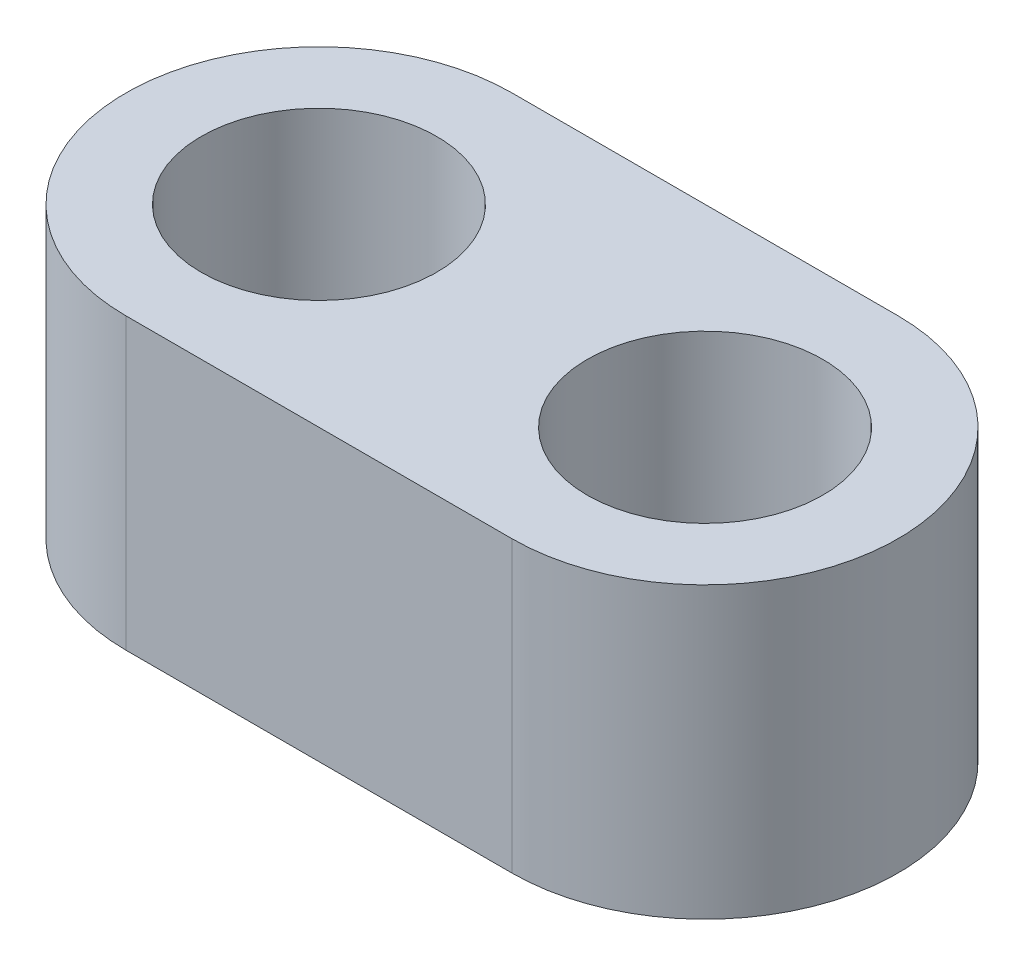
ISO-10303-21;
HEADER;
FILE_DESCRIPTION(('STEP AP214'),'2;1');
FILE_NAME('part.step','',(''),(''),'','','');
FILE_SCHEMA(('AUTOMOTIVE_DESIGN { 1 0 10303 214 1 1 1 1 }'));
ENDSEC;
DATA;
#1=APPLICATION_CONTEXT('core data for automotive mechanical design processes');
#2=APPLICATION_PROTOCOL_DEFINITION('international standard','automotive_design',2000,#1);
#3=PRODUCT_CONTEXT('',#1,'mechanical');
#4=PRODUCT('Part','Part','',(#3));
#5=PRODUCT_RELATED_PRODUCT_CATEGORY('part','',(#4));
#6=PRODUCT_DEFINITION_FORMATION('','',#4);
#7=PRODUCT_DEFINITION_CONTEXT('part definition',#1,'design');
#8=PRODUCT_DEFINITION('design','',#6,#7);
#9=PRODUCT_DEFINITION_SHAPE('','',#8);
#10=(LENGTH_UNIT() NAMED_UNIT(*) SI_UNIT(.MILLI.,.METRE.));
#11=(NAMED_UNIT(*) PLANE_ANGLE_UNIT() SI_UNIT($,.RADIAN.));
#12=(NAMED_UNIT(*) SI_UNIT($,.STERADIAN.) SOLID_ANGLE_UNIT());
#13=UNCERTAINTY_MEASURE_WITH_UNIT(LENGTH_MEASURE(1.E-05),#10,'distance_accuracy_value','');
#14=(GEOMETRIC_REPRESENTATION_CONTEXT(3) GLOBAL_UNCERTAINTY_ASSIGNED_CONTEXT((#13)) GLOBAL_UNIT_ASSIGNED_CONTEXT((#10,
#11,#12)) REPRESENTATION_CONTEXT('',''));
#15=CARTESIAN_POINT('',(0.,0.,0.));
#16=DIRECTION('',(0.,0.,1.));
#17=DIRECTION('',(1.,0.,0.));
#18=AXIS2_PLACEMENT_3D('',#15,#16,#17);
#19=CARTESIAN_POINT('',(0.,15.,0.));
#20=DIRECTION('',(0.,1.,0.));
#21=DIRECTION('',(0.,0.,1.));
#22=AXIS2_PLACEMENT_3D('',#19,#20,#21);
#23=PLANE('',#22);
#24=CARTESIAN_POINT('',(0.,15.,0.));
#25=DIRECTION('',(0.,1.,0.));
#26=DIRECTION('',(0.,0.,1.));
#27=AXIS2_PLACEMENT_3D('',#24,#25,#26);
#28=CIRCLE('',#27,6.1);
#29=CARTESIAN_POINT('',(0.,15.,6.1));
#30=VERTEX_POINT('',#29);
#31=EDGE_CURVE('E112',#30,#30,#28,.T.);
#32=ORIENTED_EDGE('',*,*,#31,.F.);
#33=EDGE_LOOP('',(#32));
#34=FACE_BOUND('',#33,.T.);
#35=CARTESIAN_POINT('',(0.,15.,0.));
#36=DIRECTION('',(0.,1.,0.));
#37=DIRECTION('',(0.,0.,1.));
#38=AXIS2_PLACEMENT_3D('',#35,#36,#37);
#39=CIRCLE('',#38,10.);
#40=CARTESIAN_POINT('',(0.,15.,-10.));
#41=VERTEX_POINT('',#40);
#42=CARTESIAN_POINT('',(0.,15.,10.));
#43=VERTEX_POINT('',#42);
#44=EDGE_CURVE('E92',#41,#43,#39,.T.);
#45=ORIENTED_EDGE('',*,*,#44,.T.);
#46=DIRECTION('',(1.,0.,0.));
#47=VECTOR('',#46,1.);
#48=CARTESIAN_POINT('',(0.,15.,10.));
#49=LINE('',#48,#47);
#50=CARTESIAN_POINT('',(20.,15.,10.));
#51=VERTEX_POINT('',#50);
#52=EDGE_CURVE('E87',#43,#51,#49,.T.);
#53=ORIENTED_EDGE('',*,*,#52,.T.);
#54=CARTESIAN_POINT('',(20.,15.,0.));
#55=DIRECTION('',(0.,1.,0.));
#56=DIRECTION('',(0.,0.,1.));
#57=AXIS2_PLACEMENT_3D('',#54,#55,#56);
#58=CIRCLE('',#57,10.);
#59=CARTESIAN_POINT('',(20.,15.,-10.));
#60=VERTEX_POINT('',#59);
#61=EDGE_CURVE('E90',#51,#60,#58,.T.);
#62=ORIENTED_EDGE('',*,*,#61,.T.);
#63=DIRECTION('',(-1.,0.,0.));
#64=VECTOR('',#63,1.);
#65=CARTESIAN_POINT('',(0.,15.,-10.));
#66=LINE('',#65,#64);
#67=EDGE_CURVE('E57',#60,#41,#66,.T.);
#68=ORIENTED_EDGE('',*,*,#67,.T.);
#69=EDGE_LOOP('',(#45,#53,#62,#68));
#70=FACE_BOUND('',#69,.T.);
#71=CARTESIAN_POINT('',(20.,15.,0.));
#72=DIRECTION('',(0.,1.,0.));
#73=DIRECTION('',(0.,0.,1.));
#74=AXIS2_PLACEMENT_3D('',#71,#72,#73);
#75=CIRCLE('',#74,6.1);
#76=CARTESIAN_POINT('',(20.,15.,6.1));
#77=VERTEX_POINT('',#76);
#78=EDGE_CURVE('E134',#77,#77,#75,.T.);
#79=ORIENTED_EDGE('',*,*,#78,.F.);
#80=EDGE_LOOP('',(#79));
#81=FACE_BOUND('',#80,.T.);
#82=ADVANCED_FACE('F39',(#34,#70,#81),#23,.T.);
#83=CARTESIAN_POINT('',(0.,0.,0.));
#84=DIRECTION('',(0.,1.,0.));
#85=DIRECTION('',(0.,0.,1.));
#86=AXIS2_PLACEMENT_3D('',#83,#84,#85);
#87=PLANE('',#86);
#88=CARTESIAN_POINT('',(0.,0.,0.));
#89=DIRECTION('',(0.,1.,0.));
#90=DIRECTION('',(0.,0.,1.));
#91=AXIS2_PLACEMENT_3D('',#88,#89,#90);
#92=CIRCLE('',#91,10.);
#93=CARTESIAN_POINT('',(0.,0.,-10.));
#94=VERTEX_POINT('',#93);
#95=CARTESIAN_POINT('',(0.,0.,10.));
#96=VERTEX_POINT('',#95);
#97=EDGE_CURVE('E108',#94,#96,#92,.T.);
#98=ORIENTED_EDGE('',*,*,#97,.F.);
#99=DIRECTION('',(-1.,0.,0.));
#100=VECTOR('',#99,1.);
#101=CARTESIAN_POINT('',(0.,0.,-10.));
#102=LINE('',#101,#100);
#103=CARTESIAN_POINT('',(20.,0.,-10.));
#104=VERTEX_POINT('',#103);
#105=EDGE_CURVE('E80',#104,#94,#102,.T.);
#106=ORIENTED_EDGE('',*,*,#105,.F.);
#107=CARTESIAN_POINT('',(20.,0.,0.));
#108=DIRECTION('',(0.,1.,0.));
#109=DIRECTION('',(0.,0.,1.));
#110=AXIS2_PLACEMENT_3D('',#107,#108,#109);
#111=CIRCLE('',#110,10.);
#112=CARTESIAN_POINT('',(20.,0.,10.));
#113=VERTEX_POINT('',#112);
#114=EDGE_CURVE('E74',#113,#104,#111,.T.);
#115=ORIENTED_EDGE('',*,*,#114,.F.);
#116=DIRECTION('',(1.,0.,0.));
#117=VECTOR('',#116,1.);
#118=CARTESIAN_POINT('',(0.,0.,10.));
#119=LINE('',#118,#117);
#120=EDGE_CURVE('E97',#96,#113,#119,.T.);
#121=ORIENTED_EDGE('',*,*,#120,.F.);
#122=EDGE_LOOP('',(#98,#106,#115,#121));
#123=FACE_BOUND('',#122,.T.);
#124=CARTESIAN_POINT('',(0.,0.,0.));
#125=DIRECTION('',(0.,1.,0.));
#126=DIRECTION('',(0.,0.,1.));
#127=AXIS2_PLACEMENT_3D('',#124,#125,#126);
#128=CIRCLE('',#127,6.1);
#129=CARTESIAN_POINT('',(0.,0.,6.1));
#130=VERTEX_POINT('',#129);
#131=EDGE_CURVE('E130',#130,#130,#128,.T.);
#132=ORIENTED_EDGE('',*,*,#131,.T.);
#133=EDGE_LOOP('',(#132));
#134=FACE_BOUND('',#133,.T.);
#135=CARTESIAN_POINT('',(20.,0.,0.));
#136=DIRECTION('',(0.,1.,0.));
#137=DIRECTION('',(0.,0.,1.));
#138=AXIS2_PLACEMENT_3D('',#135,#136,#137);
#139=CIRCLE('',#138,6.1);
#140=CARTESIAN_POINT('',(20.,0.,6.1));
#141=VERTEX_POINT('',#140);
#142=EDGE_CURVE('E138',#141,#141,#139,.T.);
#143=ORIENTED_EDGE('',*,*,#142,.T.);
#144=EDGE_LOOP('',(#143));
#145=FACE_BOUND('',#144,.T.);
#146=ADVANCED_FACE('F125',(#123,#134,#145),#87,.F.);
#147=CARTESIAN_POINT('',(0.,15.,0.));
#148=DIRECTION('',(0.,-1.,0.));
#149=DIRECTION('',(0.,0.,-1.));
#150=AXIS2_PLACEMENT_3D('',#147,#148,#149);
#151=CYLINDRICAL_SURFACE('',#150,10.);
#152=ORIENTED_EDGE('',*,*,#97,.T.);
#153=DIRECTION('',(0.,-1.,0.));
#154=VECTOR('',#153,1.);
#155=CARTESIAN_POINT('',(0.,15.,10.));
#156=LINE('',#155,#154);
#157=EDGE_CURVE('E11',#43,#96,#156,.T.);
#158=ORIENTED_EDGE('',*,*,#157,.F.);
#159=ORIENTED_EDGE('',*,*,#44,.F.);
#160=DIRECTION('',(0.,-1.,0.));
#161=VECTOR('',#160,1.);
#162=CARTESIAN_POINT('',(0.,15.,-10.));
#163=LINE('',#162,#161);
#164=EDGE_CURVE('E104',#41,#94,#163,.T.);
#165=ORIENTED_EDGE('',*,*,#164,.T.);
#166=EDGE_LOOP('',(#152,#158,#159,#165));
#167=FACE_BOUND('',#166,.T.);
#168=ADVANCED_FACE('F41',(#167),#151,.T.);
#169=CARTESIAN_POINT('',(0.,15.,10.));
#170=DIRECTION('',(0.,0.,-1.));
#171=DIRECTION('',(-1.,0.,0.));
#172=AXIS2_PLACEMENT_3D('',#169,#170,#171);
#173=PLANE('',#172);
#174=ORIENTED_EDGE('',*,*,#120,.T.);
#175=DIRECTION('',(0.,-1.,0.));
#176=VECTOR('',#175,1.);
#177=CARTESIAN_POINT('',(20.,15.,10.));
#178=LINE('',#177,#176);
#179=EDGE_CURVE('E49',#51,#113,#178,.T.);
#180=ORIENTED_EDGE('',*,*,#179,.F.);
#181=ORIENTED_EDGE('',*,*,#52,.F.);
#182=ORIENTED_EDGE('',*,*,#157,.T.);
#183=EDGE_LOOP('',(#174,#180,#181,#182));
#184=FACE_BOUND('',#183,.T.);
#185=ADVANCED_FACE('F96',(#184),#173,.F.);
#186=CARTESIAN_POINT('',(20.,15.,0.));
#187=DIRECTION('',(0.,-1.,0.));
#188=DIRECTION('',(0.,0.,-1.));
#189=AXIS2_PLACEMENT_3D('',#186,#187,#188);
#190=CYLINDRICAL_SURFACE('',#189,10.);
#191=ORIENTED_EDGE('',*,*,#114,.T.);
#192=DIRECTION('',(0.,-1.,0.));
#193=VECTOR('',#192,1.);
#194=CARTESIAN_POINT('',(20.,15.,-10.));
#195=LINE('',#194,#193);
#196=EDGE_CURVE('E99',#60,#104,#195,.T.);
#197=ORIENTED_EDGE('',*,*,#196,.F.);
#198=ORIENTED_EDGE('',*,*,#61,.F.);
#199=ORIENTED_EDGE('',*,*,#179,.T.);
#200=EDGE_LOOP('',(#191,#197,#198,#199));
#201=FACE_BOUND('',#200,.T.);
#202=ADVANCED_FACE('F100',(#201),#190,.T.);
#203=CARTESIAN_POINT('',(0.,15.,-10.));
#204=DIRECTION('',(0.,0.,1.));
#205=DIRECTION('',(1.,0.,0.));
#206=AXIS2_PLACEMENT_3D('',#203,#204,#205);
#207=PLANE('',#206);
#208=ORIENTED_EDGE('',*,*,#105,.T.);
#209=ORIENTED_EDGE('',*,*,#164,.F.);
#210=ORIENTED_EDGE('',*,*,#67,.F.);
#211=ORIENTED_EDGE('',*,*,#196,.T.);
#212=EDGE_LOOP('',(#208,#209,#210,#211));
#213=FACE_BOUND('',#212,.T.);
#214=ADVANCED_FACE('F122',(#213),#207,.F.);
#215=CARTESIAN_POINT('',(0.,15.,0.));
#216=DIRECTION('',(0.,-1.,0.));
#217=DIRECTION('',(0.,0.,-1.));
#218=AXIS2_PLACEMENT_3D('',#215,#216,#217);
#219=CYLINDRICAL_SURFACE('',#218,6.1);
#220=ORIENTED_EDGE('',*,*,#31,.T.);
#221=EDGE_LOOP('',(#220));
#222=FACE_BOUND('',#221,.T.);
#223=ORIENTED_EDGE('',*,*,#131,.F.);
#224=EDGE_LOOP('',(#223));
#225=FACE_BOUND('',#224,.T.);
#226=ADVANCED_FACE('F157',(#222,#225),#219,.F.);
#227=CARTESIAN_POINT('',(20.,15.,0.));
#228=DIRECTION('',(0.,-1.,0.));
#229=DIRECTION('',(0.,0.,-1.));
#230=AXIS2_PLACEMENT_3D('',#227,#228,#229);
#231=CYLINDRICAL_SURFACE('',#230,6.1);
#232=ORIENTED_EDGE('',*,*,#78,.T.);
#233=EDGE_LOOP('',(#232));
#234=FACE_BOUND('',#233,.T.);
#235=ORIENTED_EDGE('',*,*,#142,.F.);
#236=EDGE_LOOP('',(#235));
#237=FACE_BOUND('',#236,.T.);
#238=ADVANCED_FACE('F146',(#234,#237),#231,.F.);
#239=CLOSED_SHELL('',(#82,#146,#168,#185,#202,#214,#226,#238));
#240=MANIFOLD_SOLID_BREP('B2',#239);
#241=ADVANCED_BREP_SHAPE_REPRESENTATION('',(#18,#240),#14);
#242=SHAPE_DEFINITION_REPRESENTATION(#9,#241);
ENDSEC;
END-ISO-10303-21;
